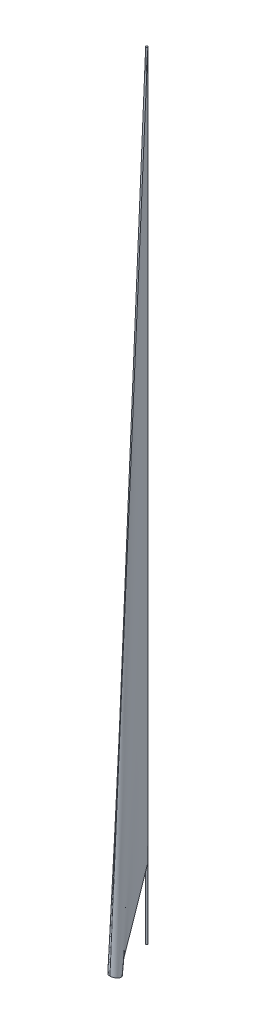
ISO-10303-21;
HEADER;
FILE_DESCRIPTION(('STEP AP214'),'2;1');
FILE_NAME('part.step','',(''),(''),'','','');
FILE_SCHEMA(('AUTOMOTIVE_DESIGN { 1 0 10303 214 1 1 1 1 }'));
ENDSEC;
DATA;
#1=APPLICATION_CONTEXT('core data for automotive mechanical design processes');
#2=APPLICATION_PROTOCOL_DEFINITION('international standard','automotive_design',2000,#1);
#3=PRODUCT_CONTEXT('',#1,'mechanical');
#4=PRODUCT('Part','Part','',(#3));
#5=PRODUCT_RELATED_PRODUCT_CATEGORY('part','',(#4));
#6=PRODUCT_DEFINITION_FORMATION('','',#4);
#7=PRODUCT_DEFINITION_CONTEXT('part definition',#1,'design');
#8=PRODUCT_DEFINITION('design','',#6,#7);
#9=PRODUCT_DEFINITION_SHAPE('','',#8);
#10=(LENGTH_UNIT() NAMED_UNIT(*) SI_UNIT(.MILLI.,.METRE.));
#11=(NAMED_UNIT(*) PLANE_ANGLE_UNIT() SI_UNIT($,.RADIAN.));
#12=(NAMED_UNIT(*) SI_UNIT($,.STERADIAN.) SOLID_ANGLE_UNIT());
#13=UNCERTAINTY_MEASURE_WITH_UNIT(LENGTH_MEASURE(1.E-05),#10,'distance_accuracy_value','');
#14=(GEOMETRIC_REPRESENTATION_CONTEXT(3) GLOBAL_UNCERTAINTY_ASSIGNED_CONTEXT((#13)) GLOBAL_UNIT_ASSIGNED_CONTEXT((#10,
#11,#12)) REPRESENTATION_CONTEXT('',''));
#15=CARTESIAN_POINT('',(0.,0.,0.));
#16=DIRECTION('',(0.,0.,1.));
#17=DIRECTION('',(1.,0.,0.));
#18=AXIS2_PLACEMENT_3D('',#15,#16,#17);
#19=CARTESIAN_POINT('',(0.,550.,0.));
#20=DIRECTION('',(0.,1.,0.));
#21=DIRECTION('',(0.,0.,1.));
#22=AXIS2_PLACEMENT_3D('',#19,#20,#21);
#23=PLANE('',#22);
#24=CARTESIAN_POINT('',(0.,550.,0.));
#25=DIRECTION('',(0.,1.,0.));
#26=DIRECTION('',(1.,0.,0.));
#27=AXIS2_PLACEMENT_3D('',#24,#25,#26);
#28=CIRCLE('',#27,0.75);
#29=CARTESIAN_POINT('',(0.75,550.,0.));
#30=VERTEX_POINT('',#29);
#31=EDGE_CURVE('E106',#30,#30,#28,.F.);
#32=ORIENTED_EDGE('',*,*,#31,.F.);
#33=EDGE_LOOP('',(#32));
#34=FACE_BOUND('',#33,.T.);
#35=ADVANCED_FACE('F17',(#34),#23,.T.);
#36=CARTESIAN_POINT('',(0.,0.,0.));
#37=DIRECTION('',(0.,1.,0.));
#38=DIRECTION('',(0.,0.,1.));
#39=AXIS2_PLACEMENT_3D('',#36,#37,#38);
#40=PLANE('',#39);
#41=CARTESIAN_POINT('',(0.,0.,0.));
#42=DIRECTION('',(0.,1.,0.));
#43=DIRECTION('',(1.,0.,0.));
#44=AXIS2_PLACEMENT_3D('',#41,#42,#43);
#45=CIRCLE('',#44,0.75);
#46=CARTESIAN_POINT('',(0.75,0.,0.));
#47=VERTEX_POINT('',#46);
#48=EDGE_CURVE('E109',#47,#47,#45,.F.);
#49=ORIENTED_EDGE('',*,*,#48,.T.);
#50=EDGE_LOOP('',(#49));
#51=FACE_BOUND('',#50,.T.);
#52=ADVANCED_FACE('F202',(#51),#40,.F.);
#53=CARTESIAN_POINT('',(0.,550.,0.));
#54=DIRECTION('',(0.,1.,0.));
#55=DIRECTION('',(0.,0.,1.));
#56=AXIS2_PLACEMENT_3D('',#53,#54,#55);
#57=CYLINDRICAL_SURFACE('',#56,0.75);
#58=CARTESIAN_POINT('',(0.747697443744632,49.8174461130097,0.0587242081065667));
#59=CARTESIAN_POINT('',(0.747769390690652,50.3174452685991,0.0578081041545399));
#60=CARTESIAN_POINT('',(0.747839663277676,50.8174444240586,0.0568918040993241));
#61=CARTESIAN_POINT('',(0.748182618152234,53.3174402015271,0.0523096860458129));
#62=CARTESIAN_POINT('',(0.748430076258001,55.3174368235344,0.0486420147161647));
#63=CARTESIAN_POINT('',(0.749335146875589,63.5420436337214,0.0335703761259827));
#64=CARTESIAN_POINT('',(0.749755010604625,69.7666538940026,0.022189568488072));
#65=CARTESIAN_POINT('',(0.749973764163235,78.0293112171144,0.00729302176104846));
#66=CARTESIAN_POINT('',(0.750000377579817,80.0673580206867,0.00363567909379865));
#67=CARTESIAN_POINT('',(0.75,82.1054048627598,-8.30637848453793E-13));
#68=B_SPLINE_CURVE_WITH_KNOTS('',3,(#58,#59,#60,#61,#62,#63,#64,#65,#66,#67),.UNSPECIFIED.,.F.,
.F.,(4,2,2,2,4),(0.,1.50000000000855,7.50000000055734,26.173862004488,32.2880122595659),.UNSPECIFIED.);
#69=CARTESIAN_POINT('',(0.747697443744685,49.8174461130139,0.0587242081052095));
#70=VERTEX_POINT('',#69);
#71=CARTESIAN_POINT('',(0.75,82.1054048627598,-8.30637848453793E-13));
#72=VERTEX_POINT('',#71);
#73=EDGE_CURVE('E309',#70,#72,#68,.T.);
#74=ORIENTED_EDGE('',*,*,#73,.F.);
#75=CARTESIAN_POINT('',(-0.747775000332354,49.8205428546624,0.0577282329364247));
#76=CARTESIAN_POINT('',(-0.74581762756561,49.7423247739898,0.0828896244408905));
#77=CARTESIAN_POINT('',(-0.742611971581617,49.6641297138284,0.108043609491916));
#78=CARTESIAN_POINT('',(-0.733533123268534,49.5075685069277,0.158406607798506));
#79=CARTESIAN_POINT('',(-0.727649359418931,49.4292029188457,0.183615441314508));
#80=CARTESIAN_POINT('',(-0.713044264921646,49.2725775249623,0.23399906751791));
#81=CARTESIAN_POINT('',(-0.704318220026041,49.1943181133179,0.259173733391011));
#82=CARTESIAN_POINT('',(-0.683355199837578,49.0352112129307,0.310355585338747));
#83=CARTESIAN_POINT('',(-0.670997860257343,48.9543778543986,0.336358225281076));
#84=CARTESIAN_POINT('',(-0.642436938595608,48.7934244129513,0.38813403139557));
#85=CARTESIAN_POINT('',(-0.626238032075224,48.7133035848513,0.413907437311554));
#86=CARTESIAN_POINT('',(-0.589209382663569,48.5541038422628,0.465119051820454));
#87=CARTESIAN_POINT('',(-0.568385210676409,48.4750237945673,0.490557624984598));
#88=CARTESIAN_POINT('',(-0.53367368868768,48.36111680169,0.527199345829951));
#89=CARTESIAN_POINT('',(-0.522178450850525,48.3256270992302,0.538615706242938));
#90=CARTESIAN_POINT('',(-0.497711803253711,48.2550959205307,0.561304231842875));
#91=CARTESIAN_POINT('',(-0.484739979075467,48.2200545732112,0.572576355556031));
#92=CARTESIAN_POINT('',(-0.45712751593199,48.1508112817333,0.594850572813159));
#93=CARTESIAN_POINT('',(-0.442497489574534,48.1166055323692,0.605853890481359));
#94=CARTESIAN_POINT('',(-0.411120251956484,48.0490943049396,0.627570914663967));
#95=CARTESIAN_POINT('',(-0.394374295141714,48.0157883075348,0.638284788246439));
#96=CARTESIAN_POINT('',(-0.362461281305338,47.9582541531436,0.656792363952434));
#97=CARTESIAN_POINT('',(-0.347859803775037,47.9337444424312,0.664676639043611));
#98=CARTESIAN_POINT('',(-0.31665883706132,47.8858087436075,0.680096568881304));
#99=CARTESIAN_POINT('',(-0.300054514837993,47.862385573712,0.687631317043357));
#100=CARTESIAN_POINT('',(-0.26414944170302,47.8170481084646,0.702215429081272));
#101=CARTESIAN_POINT('',(-0.244822785461332,47.7951517496221,0.709259023044966));
#102=CARTESIAN_POINT('',(-0.213403233644392,47.7646192574945,0.719080667400363));
#103=CARTESIAN_POINT('',(-0.202546628316385,47.7548424854647,0.722225642295271));
#104=CARTESIAN_POINT('',(-0.179929574015419,47.7362942133782,0.728192213681476));
#105=CARTESIAN_POINT('',(-0.168168529926649,47.7275233848468,0.731013594154877));
#106=CARTESIAN_POINT('',(-0.1311054125529,47.7030655360641,0.738881131793769));
#107=CARTESIAN_POINT('',(-0.104150852071535,47.6893682880963,0.743287214996755));
#108=CARTESIAN_POINT('',(-0.0610788515901881,47.6758013993136,0.74765133606089));
#109=CARTESIAN_POINT('',(-0.0461706927523215,47.6724438362436,0.74873137077653));
#110=CARTESIAN_POINT('',(-0.0159492114526633,47.6685565382538,0.749981784334103));
#111=CARTESIAN_POINT('',(-0.000636414754948761,47.6680232991942,0.750153290387937));
#112=CARTESIAN_POINT('',(0.0279858459669353,47.6697482736153,0.749598352345026));
#113=CARTESIAN_POINT('',(0.041318486610591,47.6716845184401,0.748975478983833));
#114=CARTESIAN_POINT('',(0.0674736076705331,47.6775952279371,0.747074079328877));
#115=CARTESIAN_POINT('',(0.0802955689310542,47.6815717124537,0.745794903293222));
#116=CARTESIAN_POINT('',(0.127605309845238,47.6998990955886,0.739899276473872));
#117=CARTESIAN_POINT('',(0.159617017329961,47.7200511538283,0.733416715161946));
#118=CARTESIAN_POINT('',(0.201295446640862,47.7536556119502,0.722606773407108));
#119=CARTESIAN_POINT('',(0.21355431410213,47.7646799535567,0.719060445929626));
#120=CARTESIAN_POINT('',(0.237044319008827,47.7876855931383,0.711659958937607));
#121=CARTESIAN_POINT('',(0.24827703881144,47.7996653624824,0.707806291150514));
#122=CARTESIAN_POINT('',(0.269869195686708,47.8243676326014,0.699860034948622));
#123=CARTESIAN_POINT('',(0.280225565415371,47.8370924981043,0.695766685852392));
#124=CARTESIAN_POINT('',(0.300154696784001,47.8630920131661,0.687403134021102));
#125=CARTESIAN_POINT('',(0.309727175060826,47.8763668589448,0.683132868166366));
#126=CARTESIAN_POINT('',(0.346352752747558,47.9298433915531,0.665930484894891));
#127=CARTESIAN_POINT('',(0.370775388892971,47.9716761011297,0.652473702317268));
#128=CARTESIAN_POINT('',(0.41550528308843,48.0572974243216,0.624930962089181));
#129=CARTESIAN_POINT('',(0.435804334651282,48.101089730595,0.6108438165849));
#130=CARTESIAN_POINT('',(0.473451850882286,48.1902646477078,0.582157953860697));
#131=CARTESIAN_POINT('',(0.490771671989045,48.2356581306447,0.567555739284276));
#132=CARTESIAN_POINT('',(0.522883205461042,48.3271853089477,0.538113195140074));
#133=CARTESIAN_POINT('',(0.537677346173851,48.3733182461273,0.523273109469125));
#134=CARTESIAN_POINT('',(0.568723720580228,48.4780090544251,0.4895960699352));
#135=CARTESIAN_POINT('',(0.584380639758127,48.5367261016422,0.470707911131753));
#136=CARTESIAN_POINT('',(0.613032986517518,48.6547859244724,0.432730302512423));
#137=CARTESIAN_POINT('',(0.626026269147223,48.7141291642248,0.413640703386862));
#138=CARTESIAN_POINT('',(0.649731819825393,48.8332903753972,0.375308787060787));
#139=CARTESIAN_POINT('',(0.660441601468648,48.8931087914726,0.356066326816708));
#140=CARTESIAN_POINT('',(0.67983667044716,49.0130850781332,0.317472204890921));
#141=CARTESIAN_POINT('',(0.688520455264812,49.0732431669771,0.298120472995602));
#142=CARTESIAN_POINT('',(0.703605104460086,49.1903846781266,0.260438235669261));
#143=CARTESIAN_POINT('',(0.710106872612283,49.247356426228,0.242111485857524));
#144=CARTESIAN_POINT('',(0.721573235162411,49.3613914690739,0.205428534159384));
#145=CARTESIAN_POINT('',(0.726539102880022,49.4184546483497,0.187072369419807));
#146=CARTESIAN_POINT('',(0.735013435558306,49.5325646635602,0.150365294914432));
#147=CARTESIAN_POINT('',(0.738524769535983,49.5896113077318,0.132014446839998));
#148=CARTESIAN_POINT('',(0.744143276633868,49.7035827308266,0.0953519509907934));
#149=CARTESIAN_POINT('',(0.746254948603708,49.760507308205,0.0770403680541151));
#150=CARTESIAN_POINT('',(0.747697443744632,49.8174461130097,0.0587242081065686));
#151=B_SPLINE_CURVE_WITH_KNOTS('',3,(#75,#76,#77,#78,#79,#80,#81,#82,#83,#84,#85,#86,#87,#88,
#89,#90,#91,#92,#93,#94,#95,#96,#97,#98,#99,#100,#101,#102,#103,#104,#105,#106,#107,#108,#109,
#110,#111,#112,#113,#114,#115,#116,#117,#118,#119,#120,#121,#122,#123,#124,#125,#126,#127,#128,
#129,#130,#131,#132,#133,#134,#135,#136,#137,#138,#139,#140,#141,#142,#143,#144,#145,#146,#147,
#148,#149,#150),.UNSPECIFIED.,.F.,.F.,(4,2,2,2,2,2,2,2,2,2,2,2,2,2,2,2,2,2,2,2,2,2,2,2,2,2,2,2,
2,2,2,2,2,2,2,2,2,4),(0.,0.246565107938874,0.494112058734961,0.742071703187489,
0.999414593324903,1.25644586517951,1.51316921833697,1.63018410865213,1.74723192170788,
1.86356893688333,1.97983730155488,2.06856515234131,2.15751156355584,2.24737010692014,
2.29214002200067,2.33693965173431,2.42710281717153,2.47281151774703,2.51846349421303,
2.55872850188764,2.59903344919692,2.71177423548087,2.76238478091546,2.81291591701315,
2.8636171732975,2.91433667703783,3.06476630315108,3.21549243316199,3.36759526622522,
3.51955102426345,3.71038353565595,3.90136912064425,4.09256161139892,4.28389544658035,
4.46447180151881,4.64489804803613,4.82496669572185,5.00445371601098),.UNSPECIFIED.);
#152=CARTESIAN_POINT('',(-0.747775000332354,49.8205428546624,0.0577282329364247));
#153=VERTEX_POINT('',#152);
#154=EDGE_CURVE('E308',#153,#70,#151,.T.);
#155=ORIENTED_EDGE('',*,*,#154,.F.);
#156=CARTESIAN_POINT('',(-0.747775000332354,49.8205428546624,0.0577282329364212));
#157=CARTESIAN_POINT('',(-0.747845734678762,50.3205420100762,0.0568119391054289));
#158=CARTESIAN_POINT('',(-0.747914791728076,50.8205411654058,0.0558954756658934));
#159=CARTESIAN_POINT('',(-0.748251657223176,53.3205369424496,0.0513126726090304));
#160=CARTESIAN_POINT('',(-0.748494206414484,55.3205335648358,0.0476448754150895));
#161=CARTESIAN_POINT('',(-0.74935954268898,63.3634194026114,0.0329074044283214));
#162=CARTESIAN_POINT('',(-0.749759842760109,69.4063086909694,0.0218627782370866));
#163=CARTESIAN_POINT('',(-0.749973750110723,77.4871987855741,0.00729321575809196));
#164=CARTESIAN_POINT('',(-0.750000360875907,79.5251993491322,0.0036357772251156));
#165=CARTESIAN_POINT('',(-0.75,81.5631999511976,-4.00399854775613E-12));
#166=B_SPLINE_CURVE_WITH_KNOTS('',3,(#156,#157,#158,#159,#160,#161,#162,#163,#164,#165),
.UNSPECIFIED.,.F.,.F.,(4,2,2,2,4),(0.,1.50000000000859,7.50000000055831,25.6286981559651,
31.742709691738),.UNSPECIFIED.);
#167=CARTESIAN_POINT('',(-0.75,81.5631999511976,-4.00399854775613E-12));
#168=VERTEX_POINT('',#167);
#169=EDGE_CURVE('E82',#168,#153,#166,.F.);
#170=ORIENTED_EDGE('',*,*,#169,.F.);
#171=DIRECTION('',(0.,-1.,0.));
#172=VECTOR('',#171,1.);
#173=CARTESIAN_POINT('',(-0.75,550.,0.));
#174=LINE('',#173,#172);
#175=CARTESIAN_POINT('',(-0.75,533.642953793145,0.));
#176=VERTEX_POINT('',#175);
#177=EDGE_CURVE('E126',#176,#168,#174,.T.);
#178=ORIENTED_EDGE('',*,*,#177,.F.);
#179=CARTESIAN_POINT('',(-0.74969596532996,533.642953793145,0.0213532097816576));
#180=CARTESIAN_POINT('',(-0.74970897842297,533.642953792912,0.0204637904114262));
#181=CARTESIAN_POINT('',(-0.749721947847838,533.642953792738,0.0195743704022895));
#182=CARTESIAN_POINT('',(-0.749747800606767,533.642953792484,0.0177954454191598));
#183=CARTESIAN_POINT('',(-0.749760683932611,533.642953792405,0.0169059404450474));
#184=CARTESIAN_POINT('',(-0.749786364497475,533.642953792318,0.0151268455763852));
#185=CARTESIAN_POINT('',(-0.749799161728285,533.642953792312,0.0142372556817169));
#186=CARTESIAN_POINT('',(-0.749824670107081,533.642953792348,0.0124579910163472));
#187=CARTESIAN_POINT('',(-0.749837381246864,533.642953792392,0.0115683162455281));
#188=CARTESIAN_POINT('',(-0.749862717447634,533.642953792508,0.00978888187224859));
#189=CARTESIAN_POINT('',(-0.749875342500422,533.642953792581,0.00889912226967149));
#190=CARTESIAN_POINT('',(-0.749900506531253,533.642953792733,0.00711951827725507));
#191=CARTESIAN_POINT('',(-0.749913045501101,533.642953792813,0.00622967388729988));
#192=CARTESIAN_POINT('',(-0.749938037370122,533.642953792957,0.00444990036449431));
#193=CARTESIAN_POINT('',(-0.749950490261107,533.642953793022,0.00355997123152893));
#194=CARTESIAN_POINT('',(-0.749975309976495,533.642953793116,0.00178002826705493));
#195=CARTESIAN_POINT('',(-0.749987676792715,533.642953793145,0.000890014435432212));
#196=CARTESIAN_POINT('',(-0.75,533.642953793145,0.));
#197=B_SPLINE_CURVE_WITH_KNOTS('',3,(#179,#180,#181,#182,#183,#184,#185,#186,#187,#188,#189,
#190,#191,#192,#193,#194,#195,#196),.UNSPECIFIED.,.F.,.F.,(4,2,2,2,2,2,2,2,4),(0.,
0.00266854368614147,0.00533733848691243,0.00800638429495786,0.0106756810029503,
0.0133452285035901,0.016015026689605,0.0186850754537504,0.0213553746888096),.UNSPECIFIED.);
#198=CARTESIAN_POINT('',(-0.74969596532996,533.642953793144,0.0213532097816575));
#199=VERTEX_POINT('',#198);
#200=EDGE_CURVE('E135',#199,#176,#197,.T.);
#201=ORIENTED_EDGE('',*,*,#200,.F.);
#202=CARTESIAN_POINT('',(-0.74969596532996,533.642953793145,0.0213532097816581));
#203=CARTESIAN_POINT('',(-0.749496716962629,538.792464617049,0.0283695819772208));
#204=CARTESIAN_POINT('',(-0.749195820663878,543.941975366934,0.0354365841903979));
#205=CARTESIAN_POINT('',(-0.748755657878184,549.591485635222,0.0431906926389156));
#206=CARTESIAN_POINT('',(-0.748715756377128,550.09148516266,0.0438769637106395));
#207=CARTESIAN_POINT('',(-0.748511526480732,552.591482799785,0.0473081309378871));
#208=CARTESIAN_POINT('',(-0.748333030912052,554.591480909073,0.0500524626990143));
#209=CARTESIAN_POINT('',(-0.747364943714706,564.591471457565,0.0637701678085805));
#210=CARTESIAN_POINT('',(-0.746348524025006,572.59146389261,0.0747316800546555));
#211=CARTESIAN_POINT('',(-0.74420792622956,586.217246692542,0.0933517657040367));
#212=CARTESIAN_POINT('',(-0.743205250082904,591.843037056603,0.101025127470897));
#213=CARTESIAN_POINT('',(-0.742084253076472,597.468827423583,0.108678246838705));
#214=B_SPLINE_CURVE_WITH_KNOTS('',3,(#202,#203,#204,#205,#206,#207,#208,#209,#210,#211,#212,
#213),.UNSPECIFIED.,.F.,.F.,(4,2,2,2,2,4),(0.,15.4485468203427,16.9485468203341,
22.9485468205047,46.9485468314982,63.8259338851256),.UNSPECIFIED.);
#215=CARTESIAN_POINT('',(-0.748794613676904,549.091486107698,0.0425044295158286));
#216=VERTEX_POINT('',#215);
#217=EDGE_CURVE('E194',#216,#199,#214,.F.);
#218=ORIENTED_EDGE('',*,*,#217,.F.);
#219=CARTESIAN_POINT('',(0.748835230981687,549.106910050599,0.041782733761646));
#220=CARTESIAN_POINT('',(0.748184546958439,548.857184925928,0.0534659897103415));
#221=CARTESIAN_POINT('',(0.747258098409658,548.607460999917,0.0651491897118618));
#222=CARTESIAN_POINT('',(0.744850180422096,548.108011785493,0.0885156540391897));
#223=CARTESIAN_POINT('',(0.74336870201864,547.858286497122,0.100198918362988));
#224=CARTESIAN_POINT('',(0.734564673980384,546.609609808591,0.158617593013505));
#225=CARTESIAN_POINT('',(0.723052919469384,545.610680500204,0.205351976591577));
#226=CARTESIAN_POINT('',(0.698024313314691,544.112422510855,0.275447218283551));
#227=CARTESIAN_POINT('',(0.688387965284049,543.613026449814,0.298811214858485));
#228=CARTESIAN_POINT('',(0.666166019387392,542.614300354477,0.345536131362422));
#229=CARTESIAN_POINT('',(0.65358043510252,542.114970319888,0.368897051305098));
#230=CARTESIAN_POINT('',(0.627110382876987,541.192993628292,0.412031310176492));
#231=CARTESIAN_POINT('',(0.613721259247881,540.770332823642,0.431805308755783));
#232=CARTESIAN_POINT('',(0.583907078664308,539.925119416518,0.471348257457987));
#233=CARTESIAN_POINT('',(0.567482049706026,539.502566813083,0.49111720762577));
#234=CARTESIAN_POINT('',(0.53676805404573,538.79707797713,0.524123227260698));
#235=CARTESIAN_POINT('',(0.523563522980263,538.514094729835,0.537362491698727));
#236=CARTESIAN_POINT('',(0.494946245154958,537.948238312699,0.563835879256961));
#237=CARTESIAN_POINT('',(0.47953350552501,537.665365142505,0.577070002393629));
#238=CARTESIAN_POINT('',(0.451337122118197,537.193071997815,0.599166081788659));
#239=CARTESIAN_POINT('',(0.439363235830463,537.003603907316,0.608030286346055));
#240=CARTESIAN_POINT('',(0.413735643781078,536.624780012691,0.62575344737206));
#241=CARTESIAN_POINT('',(0.400081946293149,536.435424208018,0.634612403866301));
#242=CARTESIAN_POINT('',(0.375375597660982,536.119256246687,0.649404235515621));
#243=CARTESIAN_POINT('',(0.364948402588068,535.992395488843,0.655339382774714));
#244=CARTESIAN_POINT('',(0.342778998923448,535.738787909195,0.667204350012626));
#245=CARTESIAN_POINT('',(0.331036799777933,535.612041086578,0.673134170029405));
#246=CARTESIAN_POINT('',(0.309918612543444,535.400396177055,0.683035930107238));
#247=CARTESIAN_POINT('',(0.301035181151298,535.315449467888,0.687010143892105));
#248=CARTESIAN_POINT('',(0.28221232471202,535.145673511488,0.694953078090824));
#249=CARTESIAN_POINT('',(0.272272905986149,535.060844263556,0.698921798537415));
#250=CARTESIAN_POINT('',(0.247332513173241,534.862247215781,0.708213127098255));
#251=CARTESIAN_POINT('',(0.231765609957977,534.748547233367,0.713532563398867));
#252=CARTESIAN_POINT('',(0.201962329016314,534.558908606671,0.722404783421246));
#253=CARTESIAN_POINT('',(0.188956356408558,534.482783691346,0.725966279890146));
#254=CARTESIAN_POINT('',(0.164087972437552,534.355885937482,0.731903182852935));
#255=CARTESIAN_POINT('',(0.153230340447035,534.304923221519,0.734287471319404));
#256=CARTESIAN_POINT('',(0.132468238085622,534.220041707776,0.738258652705506));
#257=CARTESIAN_POINT('',(0.123386981025434,534.18593021056,0.739854559953037));
#258=CARTESIAN_POINT('',(0.105985238027586,534.129211506519,0.742508148755377));
#259=CARTESIAN_POINT('',(0.098344517179542,534.106402255581,0.743575282050363));
#260=CARTESIAN_POINT('',(0.0836494674604718,534.068565620891,0.745345475543465));
#261=CARTESIAN_POINT('',(0.0771575382056024,534.053333070678,0.746058133724408));
#262=CARTESIAN_POINT('',(0.0660893924277788,534.031250434937,0.747091276590908));
#263=CARTESIAN_POINT('',(0.0622055470108203,534.024058229828,0.747427766433479));
#264=CARTESIAN_POINT('',(0.0537742006995772,534.01007998523,0.748081744544321));
#265=CARTESIAN_POINT('',(0.0492288220178954,534.003292741272,0.748399289160894));
#266=CARTESIAN_POINT('',(0.0398531218076181,533.991451435339,0.748953292276475));
#267=CARTESIAN_POINT('',(0.0351610242652082,533.986288964673,0.74919482248673));
#268=CARTESIAN_POINT('',(0.024419216192336,533.977170519544,0.749621438867687));
#269=CARTESIAN_POINT('',(0.0183553030858043,533.97322826939,0.749805882966653));
#270=CARTESIAN_POINT('',(0.00790186907882256,533.969775334752,0.749967439609176));
#271=CARTESIAN_POINT('',(0.00395118722445578,533.969077562069,0.750000089257445));
#272=CARTESIAN_POINT('',(-0.00445222201947566,533.969081825616,0.749999899431285));
#273=CARTESIAN_POINT('',(-0.00890508570014963,533.969972586261,0.749958230533902));
#274=CARTESIAN_POINT('',(-0.0185155241292912,533.973530066786,0.749791805752509));
#275=CARTESIAN_POINT('',(-0.0234844684258294,533.976648954863,0.749645895079309));
#276=CARTESIAN_POINT('',(-0.0322237047327625,533.98362970205,0.749319312643278));
#277=CARTESIAN_POINT('',(-0.0360521223473903,533.987427515975,0.74914163728499));
#278=CARTESIAN_POINT('',(-0.0431863076801066,533.995499697576,0.748763990520205));
#279=CARTESIAN_POINT('',(-0.0464902924430252,533.999775610126,0.748563946835086));
#280=CARTESIAN_POINT('',(-0.0563314187386292,534.013700177102,0.747912500814061));
#281=CARTESIAN_POINT('',(-0.0621716651117152,534.023825989544,0.747438773957176));
#282=CARTESIAN_POINT('',(-0.0728795705420658,534.044549488075,0.746469242629957));
#283=CARTESIAN_POINT('',(-0.0777464954223882,534.055147523048,0.745973421836286));
#284=CARTESIAN_POINT('',(-0.0868841095371131,534.07670662529,0.744964795184973));
#285=CARTESIAN_POINT('',(-0.0911491871261483,534.087670063389,0.74445187840213));
#286=CARTESIAN_POINT('',(-0.0992197029484124,534.109747972515,0.743418978267829));
#287=CARTESIAN_POINT('',(-0.10302560253901,534.120862279249,0.74289900260329));
#288=CARTESIAN_POINT('',(-0.113812459274226,534.15397655833,0.741349771799448));
#289=CARTESIAN_POINT('',(-0.120313457563445,534.176131934982,0.740313245554932));
#290=CARTESIAN_POINT('',(-0.132492891225274,534.220669066485,0.738229601074268));
#291=CARTESIAN_POINT('',(-0.13817099654282,534.243050908341,0.737182478767288));
#292=CARTESIAN_POINT('',(-0.154352207324154,534.310461872164,0.73402869241269));
#293=CARTESIAN_POINT('',(-0.16398505106785,534.355698314118,0.731912327960432));
#294=CARTESIAN_POINT('',(-0.181840523228593,534.446199702359,0.727678263916404));
#295=CARTESIAN_POINT('',(-0.190070009037332,534.4914633579,0.725560624719533));
#296=CARTESIAN_POINT('',(-0.205578194273523,534.582112623547,0.721319639684011));
#297=CARTESIAN_POINT('',(-0.212857695945637,534.627498097285,0.71919630022622));
#298=CARTESIAN_POINT('',(-0.23362176992277,534.76349645896,0.712833675506385));
#299=CARTESIAN_POINT('',(-0.246089111090446,534.854262856353,0.708587207286969));
#300=CARTESIAN_POINT('',(-0.269319013915813,535.036015956256,0.700083962327064));
#301=CARTESIAN_POINT('',(-0.280081394044145,535.127002681179,0.695827184537826));
#302=CARTESIAN_POINT('',(-0.300389019067685,535.309164723094,0.687304804718297));
#303=CARTESIAN_POINT('',(-0.309933547046691,535.400340119356,0.683039198978828));
#304=CARTESIAN_POINT('',(-0.328092655056678,535.5827837651,0.674503642727065));
#305=CARTESIAN_POINT('',(-0.336707219053297,535.674052016156,0.670233692141139));
#306=CARTESIAN_POINT('',(-0.361477848190242,535.948238568645,0.657405977407533));
#307=CARTESIAN_POINT('',(-0.376530747177079,536.131256148787,0.648843567901812));
#308=CARTESIAN_POINT('',(-0.404604119508423,536.497387484496,0.631714248764446));
#309=CARTESIAN_POINT('',(-0.417625202188414,536.68050119464,0.623147341258043));
#310=CARTESIAN_POINT('',(-0.442107585311894,537.046527799594,0.606022921295799));
#311=CARTESIAN_POINT('',(-0.453571430255711,537.229440525541,0.597465416740199));
#312=CARTESIAN_POINT('',(-0.475276176138652,537.595338493789,0.580347015301449));
#313=CARTESIAN_POINT('',(-0.485517071023608,537.778323736445,0.571786118401715));
#314=CARTESIAN_POINT('',(-0.51473507176222,538.327368081026,0.54609928262763));
#315=CARTESIAN_POINT('',(-0.53220693734505,538.693507136219,0.528969603989795));
#316=CARTESIAN_POINT('',(-0.5641957146964,539.425985904042,0.494700862068683));
#317=CARTESIAN_POINT('',(-0.57871201977464,539.792325642424,0.477561797581276));
#318=CARTESIAN_POINT('',(-0.605370134397719,540.525085506329,0.443279910970413));
#319=CARTESIAN_POINT('',(-0.617511976187279,540.891505630693,0.426137088901148));
#320=CARTESIAN_POINT('',(-0.650967745776554,541.990343633385,0.374728387929641));
#321=CARTESIAN_POINT('',(-0.669333014938308,542.722851146232,0.340458320307196));
#322=CARTESIAN_POINT('',(-0.699972891316977,544.187930057405,0.271915206688955));
#323=CARTESIAN_POINT('',(-0.712247982463794,544.920501446027,0.237642161146311));
#324=CARTESIAN_POINT('',(-0.725671994999266,545.939258984796,0.189980021336548));
#325=CARTESIAN_POINT('',(-0.729042614491617,546.225417383765,0.176592222420269));
#326=CARTESIAN_POINT('',(-0.735012578215041,546.797745420243,0.149816099644643));
#327=CARTESIAN_POINT('',(-0.737611913757238,547.083915057843,0.136427775781081));
#328=CARTESIAN_POINT('',(-0.744292491723131,547.942454445135,0.0962613793873011));
#329=CARTESIAN_POINT('',(-0.747256030753643,548.514833518267,0.0694828715969291));
#330=CARTESIAN_POINT('',(-0.748787042881602,549.088638672191,0.0426376455549514));
#331=CARTESIAN_POINT('',(-0.748790832722079,549.090062389931,0.0425710375360133));
#332=CARTESIAN_POINT('',(-0.74879461367691,549.091486107686,0.0425044295164003));
#333=B_SPLINE_CURVE_WITH_KNOTS('',3,(#219,#220,#221,#222,#223,#224,#225,#226,#227,#228,#229,
#230,#231,#232,#233,#234,#235,#236,#237,#238,#239,#240,#241,#242,#243,#244,#245,#246,#247,#248,
#249,#250,#251,#252,#253,#254,#255,#256,#257,#258,#259,#260,#261,#262,#263,#264,#265,#266,#267,
#268,#269,#270,#271,#272,#273,#274,#275,#276,#277,#278,#279,#280,#281,#282,#283,#284,#285,#286,
#287,#288,#289,#290,#291,#292,#293,#294,#295,#296,#297,#298,#299,#300,#301,#302,#303,#304,#305,
#306,#307,#308,#309,#310,#311,#312,#313,#314,#315,#316,#317,#318,#319,#320,#321,#322,#323,#324,
#325,#326,#327,#328,#329,#330,#331,#332),.UNSPECIFIED.,.F.,.F.,(4,2,2,2,2,2,2,2,2,2,2,2,2,2,2,2,
2,2,2,2,2,2,2,2,2,2,2,2,2,2,2,2,2,2,2,2,2,2,2,2,2,2,2,2,2,2,2,2,2,2,2,2,2,2,2,2,4),(0.,
0.749996237487471,1.50000458920931,4.50021101825223,6.00031058841886,7.50040325080772,
8.77039997698747,10.0403849922321,10.8911800535005,11.7419723677731,12.3121259928602,
12.8822768098315,13.2645526390472,13.6468257224012,13.9033271989339,14.159827140106,
14.5044262091248,14.7363050395495,14.8927382683675,14.9986869827439,15.0708731635729,
15.1205100745098,15.1450354642116,15.1694838427197,15.1903668082391,15.2114767670465,
15.2232891381977,15.2365993905985,15.2538978835589,15.270033424671,15.2862226994332,
15.3211970658365,15.3561977147378,15.3915057470147,15.4267780029079,15.4960857911987,
15.5654213017455,15.7042740431758,15.8424275381973,15.9804635994976,16.2555848730798,
16.5307354195135,16.8060471995133,17.0813637256585,17.6328499446452,18.1841704554169,
18.7345789939177,19.2849902570814,20.3858388537441,21.4869131951647,22.5879725831842,
24.7885524536899,26.9889574365284,27.8484302985279,28.7079128425236,30.4269414577006,
30.4312172978235),.UNSPECIFIED.);
#334=CARTESIAN_POINT('',(0.748835230981687,549.106910050599,0.041782733761646));
#335=VERTEX_POINT('',#334);
#336=EDGE_CURVE('E196',#335,#216,#333,.T.);
#337=ORIENTED_EDGE('',*,*,#336,.F.);
#338=CARTESIAN_POINT('',(0.749695952401089,534.185066749053,0.0213536637002677));
#339=CARTESIAN_POINT('',(0.749503481529132,539.159014566382,0.0281306253069417));
#340=CARTESIAN_POINT('',(0.749216137345039,544.13296231273,0.0349562468996297));
#341=CARTESIAN_POINT('',(0.748796940872539,549.606909578226,0.0424689573386725));
#342=CARTESIAN_POINT('',(0.748757705316629,550.106909105776,0.0431551896588572));
#343=CARTESIAN_POINT('',(0.748556806962431,552.606906743459,0.0465861522299943));
#344=CARTESIAN_POINT('',(0.748380982440213,554.606904853257,0.0493302853914091));
#345=CARTESIAN_POINT('',(0.747426285102734,564.6068954046,0.0630468478495016));
#346=CARTESIAN_POINT('',(0.746420688109062,572.606887842913,0.0740069670851008));
#347=CARTESIAN_POINT('',(0.744298747596612,586.233308592934,0.0926247475481773));
#348=CARTESIAN_POINT('',(0.743303783196575,591.859736903312,0.100297432471177));
#349=CARTESIAN_POINT('',(0.742190592461912,597.486165217108,0.107949638540552));
#350=B_SPLINE_CURVE_WITH_KNOTS('',3,(#338,#339,#340,#341,#342,#343,#344,#345,#346,#347,#348,
#349),.UNSPECIFIED.,.F.,.F.,(4,2,2,2,2,4),(0.,14.9218573107829,16.4218573107935,
22.4218573109657,46.4218573219496,63.3011582058433),.UNSPECIFIED.);
#351=CARTESIAN_POINT('',(0.749695952401089,534.185066749053,0.0213536637002677));
#352=VERTEX_POINT('',#351);
#353=EDGE_CURVE('E27',#352,#335,#350,.T.);
#354=ORIENTED_EDGE('',*,*,#353,.F.);
#355=CARTESIAN_POINT('',(0.75,534.185066749053,0.));
#356=CARTESIAN_POINT('',(0.749987676619711,534.185066749053,0.000890033326633933));
#357=CARTESIAN_POINT('',(0.74997530958485,534.185066749024,0.00178006604883081));
#358=CARTESIAN_POINT('',(0.749950489340752,534.18506674893,0.00356004680115182));
#359=CARTESIAN_POINT('',(0.749938036139707,534.185066748866,0.00444999483139017));
#360=CARTESIAN_POINT('',(0.749913043559126,534.185066748721,0.00622980615533457));
#361=CARTESIAN_POINT('',(0.749900504187787,534.185066748642,0.00711966944915572));
#362=CARTESIAN_POINT('',(0.749875339262521,534.18506674849,0.00889931125579106));
#363=CARTESIAN_POINT('',(0.749862713716797,534.185066748417,0.00978908976872123));
#364=CARTESIAN_POINT('',(0.74983737643869,534.185066748301,0.0115685619690878));
#365=CARTESIAN_POINT('',(0.749824664714515,534.185066748257,0.0124582556566411));
#366=CARTESIAN_POINT('',(0.749799155075455,534.18506674822,0.0142375581617541));
#367=CARTESIAN_POINT('',(0.749786357168783,534.185066748227,0.0151271669794315));
#368=CARTESIAN_POINT('',(0.749760675160701,534.185066748313,0.0169062997002806));
#369=CARTESIAN_POINT('',(0.74974779106751,534.185066748393,0.0177958236035709));
#370=CARTESIAN_POINT('',(0.749721936682386,534.185066748646,0.0195747864511189));
#371=CARTESIAN_POINT('',(0.749708966398675,534.185066748821,0.0204642253954959));
#372=CARTESIAN_POINT('',(0.749695952401089,534.185066749053,0.0213536637002677));
#373=B_SPLINE_CURVE_WITH_KNOTS('',3,(#355,#356,#357,#358,#359,#360,#361,#362,#363,#364,#365,
#366,#367,#368,#369,#370,#371,#372),.UNSPECIFIED.,.F.,.F.,(4,2,2,2,2,2,2,2,4),(0.,
0.00267035591041592,0.00534046137383676,0.00801031628278196,0.0106799205297431,
0.0133492740071838,0.0160183766075399,0.0186872282232193,0.0213558287466019),.UNSPECIFIED.);
#374=CARTESIAN_POINT('',(0.75,534.185066749053,0.));
#375=VERTEX_POINT('',#374);
#376=EDGE_CURVE('E11',#352,#375,#373,.F.);
#377=ORIENTED_EDGE('',*,*,#376,.T.);
#378=DIRECTION('',(0.,1.,0.));
#379=VECTOR('',#378,1.);
#380=CARTESIAN_POINT('',(0.75,50.,0.));
#381=LINE('',#380,#379);
#382=EDGE_CURVE('E129',#72,#375,#381,.T.);
#383=ORIENTED_EDGE('',*,*,#382,.F.);
#384=EDGE_LOOP('',(#74,#155,#170,#178,#201,#218,#337,#354,#377,#383));
#385=FACE_BOUND('',#384,.T.);
#386=ORIENTED_EDGE('',*,*,#31,.T.);
#387=EDGE_LOOP('',(#386));
#388=FACE_BOUND('',#387,.T.);
#389=ORIENTED_EDGE('',*,*,#48,.F.);
#390=EDGE_LOOP('',(#389));
#391=FACE_BOUND('',#390,.T.);
#392=ADVANCED_FACE('F198',(#385,#388,#391),#57,.T.);
#393=CARTESIAN_POINT('',(0.75,50.,0.));
#394=CARTESIAN_POINT('',(0.0110999500503392,-8.58231515566253,18.8448469834467));
#395=CARTESIAN_POINT('',(0.75,70.8333333333334,0.));
#396=CARTESIAN_POINT('',(0.494064033061172,-8.58198922582348,18.8462587406813));
#397=CARTESIAN_POINT('',(0.75,91.6666666666667,0.));
#398=CARTESIAN_POINT('',(0.976381165180416,-8.56013158059427,18.9409346036602));
#399=CARTESIAN_POINT('',(0.75,133.333333333333,0.));
#400=CARTESIAN_POINT('',(1.86795135655149,-8.47662780777013,19.3026291810597));
#401=CARTESIAN_POINT('',(0.75,154.166666666667,0.));
#402=CARTESIAN_POINT('',(2.27677175473235,-8.41501420350371,19.5695070214674));
#403=CARTESIAN_POINT('',(0.75,195.833333333333,0.));
#404=CARTESIAN_POINT('',(2.95922291721797,-8.26129613212691,20.2353331390775));
#405=CARTESIAN_POINT('',(0.75,216.666666666667,0.));
#406=CARTESIAN_POINT('',(3.23258835264628,-8.16925142877021,20.6340225510227));
#407=CARTESIAN_POINT('',(0.75,258.333333333334,0.));
#408=CARTESIAN_POINT('',(3.60263612290746,-7.96858324829281,21.503211933497));
#409=CARTESIAN_POINT('',(0.75,279.166666666667,0.));
#410=CARTESIAN_POINT('',(3.69917458757861,-7.86003778856852,21.9733739735559));
#411=CARTESIAN_POINT('',(0.75,320.833333333334,0.));
#412=CARTESIAN_POINT('',(3.70081474076032,-7.642789269609,22.914380692153));
#413=CARTESIAN_POINT('',(0.75,341.666666666667,0.));
#414=CARTESIAN_POINT('',(3.60591579159887,-7.53417067400812,23.3848595184968));
#415=CARTESIAN_POINT('',(0.75,383.333333333334,0.));
#416=CARTESIAN_POINT('',(3.23890010162066,-7.33322090916753,24.2552685768469));
#417=CARTESIAN_POINT('',(0.75,404.166666666667,0.));
#418=CARTESIAN_POINT('',(2.96692605212898,-7.24096786680087,24.6548604041874));
#419=CARTESIAN_POINT('',(0.75,445.833333333334,0.));
#420=CARTESIAN_POINT('',(2.28679985902185,-7.08672924258478,25.3229412838622));
#421=CARTESIAN_POINT('',(0.75,466.666666666667,0.));
#422=CARTESIAN_POINT('',(1.87891214036251,-7.02480362687376,25.5911705943147));
#423=CARTESIAN_POINT('',(0.75,508.333333333333,0.));
#424=CARTESIAN_POINT('',(0.988607939089732,-6.94061911488237,25.9558137769938));
#425=CARTESIAN_POINT('',(0.75,529.166666666667,0.));
#426=CARTESIAN_POINT('',(0.50662362397255,-6.91839307232567,26.0520853441089));
#427=CARTESIAN_POINT('',(0.75,550.,0.));
#428=CARTESIAN_POINT('',(0.0236672482282623,-6.91769812663936,26.0550954845831));
#429=B_SPLINE_SURFACE_WITH_KNOTS('',3,1,((#393,#394),(#395,#396),(#397,#398),(#399,#400),(#401,
#402),(#403,#404),(#405,#406),(#407,#408),(#409,#410),(#411,#412),(#413,#414),(#415,#416),(#417,
#418),(#419,#420),(#421,#422),(#423,#424),(#425,#426),(#427,#428)),.UNSPECIFIED.,.F.,.F.,.F.,(4,
2,2,2,2,2,2,2,4),(2,2),(0.,0.125,0.25,0.375,0.5,0.625,0.75,0.875,1.),(0.,1.),.UNSPECIFIED.);
#430=CARTESIAN_POINT('',(0.75,50.,0.));
#431=CARTESIAN_POINT('',(0.0110999500503392,-8.58231515566253,18.8448469834467));
#432=B_SPLINE_CURVE_WITH_KNOTS('',1,(#430,#431),.UNSPECIFIED.,.F.,.F.,(2,2),(0.,1.),.UNSPECIFIED.);
#433=CARTESIAN_POINT('',(0.0110999500503392,-8.58231515566253,18.8448469834467));
#434=VERTEX_POINT('',#433);
#435=EDGE_CURVE('E104',#70,#434,#432,.T.);
#436=CARTESIAN_POINT('',(0.75,550.,0.));
#437=CARTESIAN_POINT('',(0.0236672482282623,-6.91769812663936,26.0550954845831));
#438=B_SPLINE_CURVE_WITH_KNOTS('',1,(#436,#437),.UNSPECIFIED.,.F.,.F.,(2,2),(0.,1.),.UNSPECIFIED.);
#439=CARTESIAN_POINT('',(0.0236672482282623,-6.91769812663936,26.0550954845831));
#440=VERTEX_POINT('',#439);
#441=EDGE_CURVE('E120',#335,#440,#438,.T.);
#442=CARTESIAN_POINT('',(0.0236672482282623,-6.91769812663936,26.0550954845831));
#443=CARTESIAN_POINT('',(0.50662362397255,-6.91839307232567,26.0520853441089));
#444=CARTESIAN_POINT('',(0.988607939089732,-6.94061911488237,25.9558137769938));
#445=CARTESIAN_POINT('',(1.87891214036251,-7.02480362687376,25.5911705943147));
#446=CARTESIAN_POINT('',(2.28679985902185,-7.08672924258478,25.3229412838622));
#447=CARTESIAN_POINT('',(2.96692605212898,-7.24096786680087,24.6548604041874));
#448=CARTESIAN_POINT('',(3.23890010162066,-7.33322090916753,24.2552685768469));
#449=CARTESIAN_POINT('',(3.60591579159887,-7.53417067400812,23.3848595184968));
#450=CARTESIAN_POINT('',(3.70081474076032,-7.642789269609,22.914380692153));
#451=CARTESIAN_POINT('',(3.69917458757861,-7.86003778856852,21.9733739735559));
#452=CARTESIAN_POINT('',(3.60263612290746,-7.96858324829281,21.503211933497));
#453=CARTESIAN_POINT('',(3.23258835264628,-8.16925142877021,20.6340225510227));
#454=CARTESIAN_POINT('',(2.95922291721797,-8.26129613212691,20.2353331390775));
#455=CARTESIAN_POINT('',(2.27677175473235,-8.41501420350371,19.5695070214674));
#456=CARTESIAN_POINT('',(1.86795135655149,-8.47662780777013,19.3026291810597));
#457=CARTESIAN_POINT('',(0.976381165180416,-8.56013158059427,18.9409346036602));
#458=CARTESIAN_POINT('',(0.494064033061172,-8.58198922582348,18.8462587406813));
#459=CARTESIAN_POINT('',(0.0110999500503392,-8.58231515566253,18.8448469834467));
#460=B_SPLINE_CURVE_WITH_KNOTS('',3,(#442,#443,#444,#445,#446,#447,#448,#449,#450,#451,#452,
#453,#454,#455,#456,#457,#458,#459),.UNSPECIFIED.,.F.,.F.,(4,2,2,2,2,2,2,2,4),(0.,0.125,0.25,
0.375,0.5,0.625,0.75,0.875,1.),.UNSPECIFIED.);
#461=EDGE_CURVE('E275',#434,#440,#460,.F.);
#462=ORIENTED_EDGE('',*,*,#435,.F.);
#463=ORIENTED_EDGE('',*,*,#73,.T.);
#464=ORIENTED_EDGE('',*,*,#382,.T.);
#465=ORIENTED_EDGE('',*,*,#376,.F.);
#466=ORIENTED_EDGE('',*,*,#353,.T.);
#467=ORIENTED_EDGE('',*,*,#441,.T.);
#468=ORIENTED_EDGE('',*,*,#461,.F.);
#469=EDGE_LOOP('',(#462,#463,#464,#465,#466,#467,#468));
#470=FACE_BOUND('',#469,.T.);
#471=ADVANCED_FACE('F201',(#470),#429,.T.);
#472=CARTESIAN_POINT('',(0.,-7.75,22.45));
#473=DIRECTION('',(0.,0.974370064785235,-0.224951054343865));
#474=DIRECTION('',(0.,0.224951054343865,0.974370064785235));
#475=AXIS2_PLACEMENT_3D('',#472,#473,#474);
#476=PLANE('',#475);
#477=ORIENTED_EDGE('',*,*,#461,.T.);
#478=CARTESIAN_POINT('',(0.,-7.75,22.45));
#479=DIRECTION('',(0.,0.974370064785235,-0.224951054343865));
#480=DIRECTION('',(-1.,0.,0.));
#481=AXIS2_PLACEMENT_3D('',#478,#479,#480);
#482=CIRCLE('',#481,3.7);
#483=CARTESIAN_POINT('',(-0.0110999500503397,-6.91768484433747,26.0551530165533));
#484=VERTEX_POINT('',#483);
#485=EDGE_CURVE('E98',#440,#484,#482,.F.);
#486=ORIENTED_EDGE('',*,*,#485,.T.);
#487=CARTESIAN_POINT('',(-0.0236672482282662,-8.58230187336064,18.8449045154169));
#488=CARTESIAN_POINT('',(-0.506623623972555,-8.58160692767433,18.8479146558911));
#489=CARTESIAN_POINT('',(-0.988607939089736,-8.55938088511763,18.9441862230063));
#490=CARTESIAN_POINT('',(-1.87891214036251,-8.47519637312624,19.3088294056853));
#491=CARTESIAN_POINT('',(-2.28679985902185,-8.41327075741522,19.5770587161378));
#492=CARTESIAN_POINT('',(-2.96692605212898,-8.25903213319913,20.2451395958126));
#493=CARTESIAN_POINT('',(-3.23890010162066,-8.16677909083247,20.6447314231531));
#494=CARTESIAN_POINT('',(-3.60591579159887,-7.96582932599188,21.5151404815032));
#495=CARTESIAN_POINT('',(-3.70081474076032,-7.857210730391,21.985619307847));
#496=CARTESIAN_POINT('',(-3.69917458757861,-7.63996221143148,22.9266260264441));
#497=CARTESIAN_POINT('',(-3.60263612290746,-7.53141675170719,23.396788066503));
#498=CARTESIAN_POINT('',(-3.23258835264628,-7.33074857122979,24.2659774489773));
#499=CARTESIAN_POINT('',(-2.95922291721797,-7.23870386787309,24.6646668609226));
#500=CARTESIAN_POINT('',(-2.27677175473235,-7.08498579649629,25.3304929785326));
#501=CARTESIAN_POINT('',(-1.86795135655149,-7.02337219222987,25.5973708189403));
#502=CARTESIAN_POINT('',(-0.976381165180416,-6.93986841940573,25.9590653963397));
#503=CARTESIAN_POINT('',(-0.494064033061164,-6.91801077417652,26.0537412593188));
#504=CARTESIAN_POINT('',(-0.0110999500503397,-6.91768484433747,26.0551530165533));
#505=B_SPLINE_CURVE_WITH_KNOTS('',3,(#487,#488,#489,#490,#491,#492,#493,#494,#495,#496,#497,
#498,#499,#500,#501,#502,#503,#504),.UNSPECIFIED.,.F.,.F.,(4,2,2,2,2,2,2,2,4),(0.,0.125,0.25,
0.375,0.5,0.625,0.75,0.875,1.),.UNSPECIFIED.);
#506=CARTESIAN_POINT('',(-0.0236672482282662,-8.58230187336064,18.8449045154169));
#507=VERTEX_POINT('',#506);
#508=EDGE_CURVE('E80',#484,#507,#505,.F.);
#509=ORIENTED_EDGE('',*,*,#508,.T.);
#510=CARTESIAN_POINT('',(0.,-7.75,22.45));
#511=DIRECTION('',(0.,0.974370064785235,-0.224951054343865));
#512=DIRECTION('',(-1.,0.,0.));
#513=AXIS2_PLACEMENT_3D('',#510,#511,#512);
#514=CIRCLE('',#513,3.7);
#515=EDGE_CURVE('E87',#507,#434,#514,.F.);
#516=ORIENTED_EDGE('',*,*,#515,.T.);
#517=EDGE_LOOP('',(#477,#486,#509,#516));
#518=FACE_BOUND('',#517,.T.);
#519=ADVANCED_FACE('F95',(#518),#476,.F.);
#520=CARTESIAN_POINT('',(0.75,550.,0.));
#521=CARTESIAN_POINT('',(0.0236672482282623,-6.91769812663936,26.0550954845831));
#522=CARTESIAN_POINT('',(0.25,550.,0.));
#523=CARTESIAN_POINT('',(0.0120783598756913,-6.91768145091382,26.055167715086));
#524=CARTESIAN_POINT('',(-0.25,550.,0.));
#525=CARTESIAN_POINT('',(0.000489123243679488,-6.9176770234147,26.0551868926916));
#526=CARTESIAN_POINT('',(-0.75,550.,0.));
#527=CARTESIAN_POINT('',(-0.0110999500503397,-6.91768484433747,26.0551530165533));
#528=B_SPLINE_SURFACE_WITH_KNOTS('',3,1,((#520,#521),(#522,#523),(#524,#525),(#526,#527)),
.UNSPECIFIED.,.F.,.F.,.F.,(4,4),(2,2),(0.,1.),(0.,1.),.UNSPECIFIED.);
#529=CARTESIAN_POINT('',(-0.75,550.,0.));
#530=CARTESIAN_POINT('',(-0.0110999500503397,-6.91768484433747,26.0551530165533));
#531=B_SPLINE_CURVE_WITH_KNOTS('',1,(#529,#530),.UNSPECIFIED.,.F.,.F.,(2,2),(0.,1.),.UNSPECIFIED.);
#532=EDGE_CURVE('E99',#216,#484,#531,.T.);
#533=ORIENTED_EDGE('',*,*,#441,.F.);
#534=ORIENTED_EDGE('',*,*,#336,.T.);
#535=ORIENTED_EDGE('',*,*,#532,.T.);
#536=ORIENTED_EDGE('',*,*,#485,.F.);
#537=EDGE_LOOP('',(#533,#534,#535,#536));
#538=FACE_BOUND('',#537,.T.);
#539=ADVANCED_FACE('F152',(#538),#528,.T.);
#540=CARTESIAN_POINT('',(-0.75,550.,0.));
#541=CARTESIAN_POINT('',(-0.0110999500503397,-6.91768484433747,26.0551530165533));
#542=CARTESIAN_POINT('',(-0.75,529.166666666667,0.));
#543=CARTESIAN_POINT('',(-0.494064033061164,-6.91801077417652,26.0537412593188));
#544=CARTESIAN_POINT('',(-0.75,508.333333333333,0.));
#545=CARTESIAN_POINT('',(-0.976381165180416,-6.93986841940573,25.9590653963397));
#546=CARTESIAN_POINT('',(-0.75,466.666666666667,0.));
#547=CARTESIAN_POINT('',(-1.86795135655149,-7.02337219222987,25.5973708189403));
#548=CARTESIAN_POINT('',(-0.75,445.833333333334,0.));
#549=CARTESIAN_POINT('',(-2.27677175473235,-7.08498579649629,25.3304929785326));
#550=CARTESIAN_POINT('',(-0.75,404.166666666667,0.));
#551=CARTESIAN_POINT('',(-2.95922291721797,-7.23870386787309,24.6646668609226));
#552=CARTESIAN_POINT('',(-0.75,383.333333333334,0.));
#553=CARTESIAN_POINT('',(-3.23258835264628,-7.33074857122979,24.2659774489773));
#554=CARTESIAN_POINT('',(-0.75,341.666666666667,0.));
#555=CARTESIAN_POINT('',(-3.60263612290746,-7.53141675170719,23.396788066503));
#556=CARTESIAN_POINT('',(-0.75,320.833333333334,0.));
#557=CARTESIAN_POINT('',(-3.69917458757861,-7.63996221143148,22.9266260264441));
#558=CARTESIAN_POINT('',(-0.75,279.166666666667,0.));
#559=CARTESIAN_POINT('',(-3.70081474076032,-7.857210730391,21.985619307847));
#560=CARTESIAN_POINT('',(-0.75,258.333333333334,0.));
#561=CARTESIAN_POINT('',(-3.60591579159887,-7.96582932599188,21.5151404815032));
#562=CARTESIAN_POINT('',(-0.75,216.666666666667,0.));
#563=CARTESIAN_POINT('',(-3.23890010162066,-8.16677909083247,20.6447314231531));
#564=CARTESIAN_POINT('',(-0.75,195.833333333333,0.));
#565=CARTESIAN_POINT('',(-2.96692605212898,-8.25903213319913,20.2451395958126));
#566=CARTESIAN_POINT('',(-0.75,154.166666666667,0.));
#567=CARTESIAN_POINT('',(-2.28679985902185,-8.41327075741522,19.5770587161378));
#568=CARTESIAN_POINT('',(-0.75,133.333333333333,0.));
#569=CARTESIAN_POINT('',(-1.87891214036251,-8.47519637312624,19.3088294056853));
#570=CARTESIAN_POINT('',(-0.75,91.6666666666667,0.));
#571=CARTESIAN_POINT('',(-0.988607939089736,-8.55938088511763,18.9441862230063));
#572=CARTESIAN_POINT('',(-0.75,70.8333333333334,0.));
#573=CARTESIAN_POINT('',(-0.506623623972555,-8.58160692767433,18.8479146558911));
#574=CARTESIAN_POINT('',(-0.75,50.,0.));
#575=CARTESIAN_POINT('',(-0.0236672482282662,-8.58230187336064,18.8449045154169));
#576=B_SPLINE_SURFACE_WITH_KNOTS('',3,1,((#540,#541),(#542,#543),(#544,#545),(#546,#547),(#548,
#549),(#550,#551),(#552,#553),(#554,#555),(#556,#557),(#558,#559),(#560,#561),(#562,#563),(#564,
#565),(#566,#567),(#568,#569),(#570,#571),(#572,#573),(#574,#575)),.UNSPECIFIED.,.F.,.F.,.F.,(4,
2,2,2,2,2,2,2,4),(2,2),(0.,0.125,0.25,0.375,0.5,0.625,0.75,0.875,1.),(0.,1.),.UNSPECIFIED.);
#577=CARTESIAN_POINT('',(-0.75,50.,0.));
#578=CARTESIAN_POINT('',(-0.0236672482282662,-8.58230187336064,18.8449045154169));
#579=B_SPLINE_CURVE_WITH_KNOTS('',1,(#577,#578),.UNSPECIFIED.,.F.,.F.,(2,2),(0.,1.),.UNSPECIFIED.);
#580=EDGE_CURVE('E74',#153,#507,#579,.T.);
#581=ORIENTED_EDGE('',*,*,#177,.T.);
#582=ORIENTED_EDGE('',*,*,#169,.T.);
#583=ORIENTED_EDGE('',*,*,#580,.T.);
#584=ORIENTED_EDGE('',*,*,#508,.F.);
#585=ORIENTED_EDGE('',*,*,#532,.F.);
#586=ORIENTED_EDGE('',*,*,#217,.T.);
#587=ORIENTED_EDGE('',*,*,#200,.T.);
#588=EDGE_LOOP('',(#581,#582,#583,#584,#585,#586,#587));
#589=FACE_BOUND('',#588,.T.);
#590=ADVANCED_FACE('F78',(#589),#576,.T.);
#591=CARTESIAN_POINT('',(-0.75,50.,0.));
#592=CARTESIAN_POINT('',(-0.0236672482282662,-8.58230187336064,18.8449045154169));
#593=CARTESIAN_POINT('',(-0.25,50.,0.));
#594=CARTESIAN_POINT('',(-0.0120783598756948,-8.58231854908618,18.844832284914));
#595=CARTESIAN_POINT('',(0.25,50.,0.));
#596=CARTESIAN_POINT('',(-0.000489123243682625,-8.5823229765853,18.8448131073084));
#597=CARTESIAN_POINT('',(0.75,50.,0.));
#598=CARTESIAN_POINT('',(0.0110999500503392,-8.58231515566253,18.8448469834467));
#599=B_SPLINE_SURFACE_WITH_KNOTS('',3,1,((#591,#592),(#593,#594),(#595,#596),(#597,#598)),
.UNSPECIFIED.,.F.,.F.,.F.,(4,4),(2,2),(0.,1.),(0.,1.),.UNSPECIFIED.);
#600=ORIENTED_EDGE('',*,*,#580,.F.);
#601=ORIENTED_EDGE('',*,*,#154,.T.);
#602=ORIENTED_EDGE('',*,*,#435,.T.);
#603=ORIENTED_EDGE('',*,*,#515,.F.);
#604=EDGE_LOOP('',(#600,#601,#602,#603));
#605=FACE_BOUND('',#604,.T.);
#606=ADVANCED_FACE('F102',(#605),#599,.T.);
#607=CLOSED_SHELL('',(#35,#52,#392,#471,#519,#539,#590,#606));
#608=MANIFOLD_SOLID_BREP('B1',#607);
#609=ADVANCED_BREP_SHAPE_REPRESENTATION('',(#18,#608),#14);
#610=SHAPE_DEFINITION_REPRESENTATION(#9,#609);
ENDSEC;
END-ISO-10303-21;
